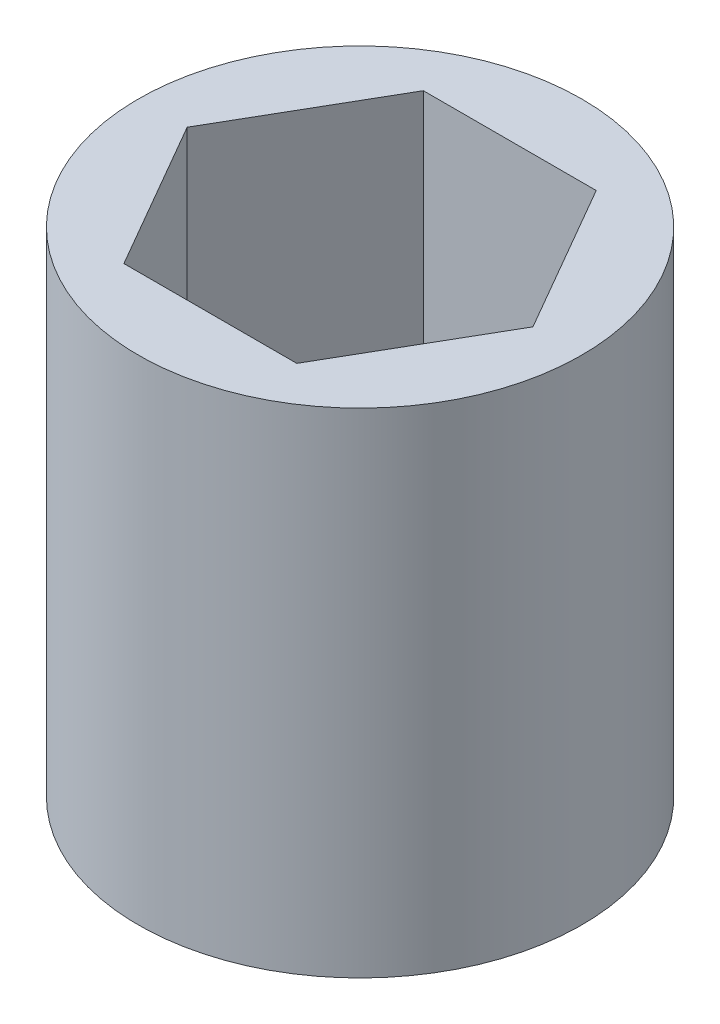
ISO-10303-21;
HEADER;
FILE_DESCRIPTION(('STEP AP214'),'2;1');
FILE_NAME('part.step','',(''),(''),'','','');
FILE_SCHEMA(('AUTOMOTIVE_DESIGN { 1 0 10303 214 1 1 1 1 }'));
ENDSEC;
DATA;
#1=APPLICATION_CONTEXT('core data for automotive mechanical design processes');
#2=APPLICATION_PROTOCOL_DEFINITION('international standard','automotive_design',2000,#1);
#3=PRODUCT_CONTEXT('',#1,'mechanical');
#4=PRODUCT('Part','Part','',(#3));
#5=PRODUCT_RELATED_PRODUCT_CATEGORY('part','',(#4));
#6=PRODUCT_DEFINITION_FORMATION('','',#4);
#7=PRODUCT_DEFINITION_CONTEXT('part definition',#1,'design');
#8=PRODUCT_DEFINITION('design','',#6,#7);
#9=PRODUCT_DEFINITION_SHAPE('','',#8);
#10=(LENGTH_UNIT() NAMED_UNIT(*) SI_UNIT(.MILLI.,.METRE.));
#11=(NAMED_UNIT(*) PLANE_ANGLE_UNIT() SI_UNIT($,.RADIAN.));
#12=(NAMED_UNIT(*) SI_UNIT($,.STERADIAN.) SOLID_ANGLE_UNIT());
#13=UNCERTAINTY_MEASURE_WITH_UNIT(LENGTH_MEASURE(1.E-05),#10,'distance_accuracy_value','');
#14=(GEOMETRIC_REPRESENTATION_CONTEXT(3) GLOBAL_UNCERTAINTY_ASSIGNED_CONTEXT((#13)) GLOBAL_UNIT_ASSIGNED_CONTEXT((#10,
#11,#12)) REPRESENTATION_CONTEXT('',''));
#15=CARTESIAN_POINT('',(0.,0.,0.));
#16=DIRECTION('',(0.,0.,1.));
#17=DIRECTION('',(1.,0.,0.));
#18=AXIS2_PLACEMENT_3D('',#15,#16,#17);
#19=CARTESIAN_POINT('',(0.,22.606,0.));
#20=DIRECTION('',(0.,1.,0.));
#21=DIRECTION('',(0.,0.,1.));
#22=AXIS2_PLACEMENT_3D('',#19,#20,#21);
#23=PLANE('',#22);
#24=CARTESIAN_POINT('',(0.,22.606,0.));
#25=DIRECTION('',(0.,1.,0.));
#26=DIRECTION('',(0.,0.,1.));
#27=AXIS2_PLACEMENT_3D('',#24,#25,#26);
#28=CIRCLE('',#27,10.16);
#29=CARTESIAN_POINT('',(0.,22.606,-10.16));
#30=VERTEX_POINT('',#29);
#31=EDGE_CURVE('E11',#30,#30,#28,.T.);
#32=ORIENTED_EDGE('',*,*,#31,.T.);
#33=EDGE_LOOP('',(#32));
#34=FACE_BOUND('',#33,.T.);
#35=DIRECTION('',(-0.5,0.,-0.866025403784438));
#36=VECTOR('',#35,1.);
#37=CARTESIAN_POINT('',(7.9189362922049,22.606,0.));
#38=LINE('',#37,#36);
#39=CARTESIAN_POINT('',(7.9189362922049,22.606,0.));
#40=VERTEX_POINT('',#39);
#41=CARTESIAN_POINT('',(3.95946814610245,22.606,-6.858));
#42=VERTEX_POINT('',#41);
#43=EDGE_CURVE('E103',#40,#42,#38,.T.);
#44=ORIENTED_EDGE('',*,*,#43,.F.);
#45=DIRECTION('',(0.5,0.,-0.866025403784439));
#46=VECTOR('',#45,1.);
#47=CARTESIAN_POINT('',(3.95946814610245,22.606,6.858));
#48=LINE('',#47,#46);
#49=CARTESIAN_POINT('',(3.95946814610245,22.606,6.858));
#50=VERTEX_POINT('',#49);
#51=EDGE_CURVE('E95',#50,#40,#48,.T.);
#52=ORIENTED_EDGE('',*,*,#51,.F.);
#53=DIRECTION('',(1.,0.,0.));
#54=VECTOR('',#53,1.);
#55=CARTESIAN_POINT('',(-3.95946814610245,22.606,6.858));
#56=LINE('',#55,#54);
#57=CARTESIAN_POINT('',(-3.95946814610245,22.606,6.858));
#58=VERTEX_POINT('',#57);
#59=EDGE_CURVE('E125',#58,#50,#56,.T.);
#60=ORIENTED_EDGE('',*,*,#59,.F.);
#61=DIRECTION('',(0.5,0.,0.866025403784439));
#62=VECTOR('',#61,1.);
#63=CARTESIAN_POINT('',(-7.91893629220491,22.606,0.));
#64=LINE('',#63,#62);
#65=CARTESIAN_POINT('',(-7.91893629220491,22.606,0.));
#66=VERTEX_POINT('',#65);
#67=EDGE_CURVE('E123',#66,#58,#64,.T.);
#68=ORIENTED_EDGE('',*,*,#67,.F.);
#69=DIRECTION('',(-0.5,0.,0.866025403784439));
#70=VECTOR('',#69,1.);
#71=CARTESIAN_POINT('',(-3.95946814610245,22.606,-6.858));
#72=LINE('',#71,#70);
#73=CARTESIAN_POINT('',(-3.95946814610245,22.606,-6.858));
#74=VERTEX_POINT('',#73);
#75=EDGE_CURVE('E118',#74,#66,#72,.T.);
#76=ORIENTED_EDGE('',*,*,#75,.F.);
#77=DIRECTION('',(-1.,0.,0.));
#78=VECTOR('',#77,1.);
#79=CARTESIAN_POINT('',(3.95946814610245,22.606,-6.858));
#80=LINE('',#79,#78);
#81=EDGE_CURVE('E115',#42,#74,#80,.T.);
#82=ORIENTED_EDGE('',*,*,#81,.F.);
#83=EDGE_LOOP('',(#44,#52,#60,#68,#76,#82));
#84=FACE_BOUND('',#83,.T.);
#85=ADVANCED_FACE('F38',(#34,#84),#23,.T.);
#86=CARTESIAN_POINT('',(0.,0.,0.));
#87=DIRECTION('',(0.,1.,0.));
#88=DIRECTION('',(0.,0.,1.));
#89=AXIS2_PLACEMENT_3D('',#86,#87,#88);
#90=PLANE('',#89);
#91=CARTESIAN_POINT('',(0.,0.,0.));
#92=DIRECTION('',(0.,1.,0.));
#93=DIRECTION('',(0.,0.,1.));
#94=AXIS2_PLACEMENT_3D('',#91,#92,#93);
#95=CIRCLE('',#94,10.16);
#96=CARTESIAN_POINT('',(0.,0.,-10.16));
#97=VERTEX_POINT('',#96);
#98=EDGE_CURVE('E42',#97,#97,#95,.T.);
#99=ORIENTED_EDGE('',*,*,#98,.F.);
#100=EDGE_LOOP('',(#99));
#101=FACE_BOUND('',#100,.T.);
#102=DIRECTION('',(0.5,0.,-0.866025403784439));
#103=VECTOR('',#102,1.);
#104=CARTESIAN_POINT('',(3.95946814610245,0.,6.858));
#105=LINE('',#104,#103);
#106=CARTESIAN_POINT('',(3.95946814610245,0.,6.858));
#107=VERTEX_POINT('',#106);
#108=CARTESIAN_POINT('',(7.9189362922049,0.,0.));
#109=VERTEX_POINT('',#108);
#110=EDGE_CURVE('E62',#107,#109,#105,.T.);
#111=ORIENTED_EDGE('',*,*,#110,.T.);
#112=DIRECTION('',(-0.5,0.,-0.866025403784438));
#113=VECTOR('',#112,1.);
#114=CARTESIAN_POINT('',(7.9189362922049,0.,0.));
#115=LINE('',#114,#113);
#116=CARTESIAN_POINT('',(3.95946814610245,0.,-6.858));
#117=VERTEX_POINT('',#116);
#118=EDGE_CURVE('E110',#109,#117,#115,.T.);
#119=ORIENTED_EDGE('',*,*,#118,.T.);
#120=DIRECTION('',(-1.,0.,0.));
#121=VECTOR('',#120,1.);
#122=CARTESIAN_POINT('',(3.95946814610245,0.,-6.858));
#123=LINE('',#122,#121);
#124=CARTESIAN_POINT('',(-3.95946814610245,0.,-6.858));
#125=VERTEX_POINT('',#124);
#126=EDGE_CURVE('E129',#117,#125,#123,.T.);
#127=ORIENTED_EDGE('',*,*,#126,.T.);
#128=DIRECTION('',(-0.5,0.,0.866025403784439));
#129=VECTOR('',#128,1.);
#130=CARTESIAN_POINT('',(-3.95946814610245,0.,-6.858));
#131=LINE('',#130,#129);
#132=CARTESIAN_POINT('',(-7.91893629220491,0.,0.));
#133=VERTEX_POINT('',#132);
#134=EDGE_CURVE('E133',#125,#133,#131,.T.);
#135=ORIENTED_EDGE('',*,*,#134,.T.);
#136=DIRECTION('',(0.5,0.,0.866025403784439));
#137=VECTOR('',#136,1.);
#138=CARTESIAN_POINT('',(-7.91893629220491,0.,0.));
#139=LINE('',#138,#137);
#140=CARTESIAN_POINT('',(-3.95946814610245,0.,6.858));
#141=VERTEX_POINT('',#140);
#142=EDGE_CURVE('E137',#133,#141,#139,.T.);
#143=ORIENTED_EDGE('',*,*,#142,.T.);
#144=DIRECTION('',(1.,0.,0.));
#145=VECTOR('',#144,1.);
#146=CARTESIAN_POINT('',(-3.95946814610245,0.,6.858));
#147=LINE('',#146,#145);
#148=EDGE_CURVE('E104',#141,#107,#147,.T.);
#149=ORIENTED_EDGE('',*,*,#148,.T.);
#150=EDGE_LOOP('',(#111,#119,#127,#135,#143,#149));
#151=FACE_BOUND('',#150,.T.);
#152=ADVANCED_FACE('F157',(#101,#151),#90,.F.);
#153=CARTESIAN_POINT('',(0.,22.606,0.));
#154=DIRECTION('',(0.,-1.,0.));
#155=DIRECTION('',(0.,0.,-1.));
#156=AXIS2_PLACEMENT_3D('',#153,#154,#155);
#157=CYLINDRICAL_SURFACE('',#156,10.16);
#158=CARTESIAN_POINT('',(0.,22.606,-10.16));
#159=CARTESIAN_POINT('',(0.,22.3705208333333,-10.16));
#160=CARTESIAN_POINT('',(0.,22.1350416666667,-10.16));
#161=CARTESIAN_POINT('',(0.,21.6640833333333,-10.16));
#162=CARTESIAN_POINT('',(0.,21.4286041666667,-10.16));
#163=CARTESIAN_POINT('',(0.,20.9576458333333,-10.16));
#164=CARTESIAN_POINT('',(0.,20.7221666666667,-10.16));
#165=CARTESIAN_POINT('',(0.,20.2512083333333,-10.16));
#166=CARTESIAN_POINT('',(0.,20.0157291666667,-10.16));
#167=CARTESIAN_POINT('',(0.,19.5447708333333,-10.16));
#168=CARTESIAN_POINT('',(0.,19.3092916666667,-10.16));
#169=CARTESIAN_POINT('',(0.,18.8383333333333,-10.16));
#170=CARTESIAN_POINT('',(0.,18.6028541666667,-10.16));
#171=CARTESIAN_POINT('',(0.,18.1318958333333,-10.16));
#172=CARTESIAN_POINT('',(0.,17.8964166666667,-10.16));
#173=CARTESIAN_POINT('',(0.,17.4254583333333,-10.16));
#174=CARTESIAN_POINT('',(0.,17.1899791666667,-10.16));
#175=CARTESIAN_POINT('',(0.,16.7190208333333,-10.16));
#176=CARTESIAN_POINT('',(0.,16.4835416666667,-10.16));
#177=CARTESIAN_POINT('',(0.,16.0125833333333,-10.16));
#178=CARTESIAN_POINT('',(0.,15.7771041666667,-10.16));
#179=CARTESIAN_POINT('',(0.,15.3061458333333,-10.16));
#180=CARTESIAN_POINT('',(0.,15.0706666666667,-10.16));
#181=CARTESIAN_POINT('',(0.,14.5997083333333,-10.16));
#182=CARTESIAN_POINT('',(0.,14.3642291666667,-10.16));
#183=CARTESIAN_POINT('',(0.,13.8932708333333,-10.16));
#184=CARTESIAN_POINT('',(0.,13.6577916666667,-10.16));
#185=CARTESIAN_POINT('',(0.,13.1868333333333,-10.16));
#186=CARTESIAN_POINT('',(0.,12.9513541666667,-10.16));
#187=CARTESIAN_POINT('',(0.,12.4803958333333,-10.16));
#188=CARTESIAN_POINT('',(0.,12.2449166666667,-10.16));
#189=CARTESIAN_POINT('',(0.,11.7739583333333,-10.16));
#190=CARTESIAN_POINT('',(0.,11.5384791666667,-10.16));
#191=CARTESIAN_POINT('',(0.,11.0675208333333,-10.16));
#192=CARTESIAN_POINT('',(0.,10.8320416666667,-10.16));
#193=CARTESIAN_POINT('',(0.,10.3610833333333,-10.16));
#194=CARTESIAN_POINT('',(0.,10.1256041666667,-10.16));
#195=CARTESIAN_POINT('',(0.,9.65464583333333,-10.16));
#196=CARTESIAN_POINT('',(0.,9.41916666666666,-10.16));
#197=CARTESIAN_POINT('',(0.,8.94820833333333,-10.16));
#198=CARTESIAN_POINT('',(0.,8.71272916666666,-10.16));
#199=CARTESIAN_POINT('',(0.,8.24177083333333,-10.16));
#200=CARTESIAN_POINT('',(0.,8.00629166666666,-10.16));
#201=CARTESIAN_POINT('',(0.,7.53533333333333,-10.16));
#202=CARTESIAN_POINT('',(0.,7.29985416666666,-10.16));
#203=CARTESIAN_POINT('',(0.,6.82889583333333,-10.16));
#204=CARTESIAN_POINT('',(0.,6.59341666666666,-10.16));
#205=CARTESIAN_POINT('',(0.,6.12245833333333,-10.16));
#206=CARTESIAN_POINT('',(0.,5.88697916666667,-10.16));
#207=CARTESIAN_POINT('',(0.,5.41602083333333,-10.16));
#208=CARTESIAN_POINT('',(0.,5.18054166666667,-10.16));
#209=CARTESIAN_POINT('',(0.,4.70958333333333,-10.16));
#210=CARTESIAN_POINT('',(0.,4.47410416666667,-10.16));
#211=CARTESIAN_POINT('',(0.,4.00314583333333,-10.16));
#212=CARTESIAN_POINT('',(0.,3.76766666666667,-10.16));
#213=CARTESIAN_POINT('',(0.,3.29670833333333,-10.16));
#214=CARTESIAN_POINT('',(0.,3.06122916666667,-10.16));
#215=CARTESIAN_POINT('',(0.,2.59027083333333,-10.16));
#216=CARTESIAN_POINT('',(0.,2.35479166666666,-10.16));
#217=CARTESIAN_POINT('',(0.,1.88383333333333,-10.16));
#218=CARTESIAN_POINT('',(0.,1.64835416666666,-10.16));
#219=CARTESIAN_POINT('',(0.,1.17739583333333,-10.16));
#220=CARTESIAN_POINT('',(0.,0.941916666666664,-10.16));
#221=CARTESIAN_POINT('',(0.,0.47095833333333,-10.16));
#222=CARTESIAN_POINT('',(0.,0.235479166666663,-10.16));
#223=CARTESIAN_POINT('',(0.,0.,-10.16));
#224=B_SPLINE_CURVE_WITH_KNOTS('',3,(#158,#159,#160,#161,#162,#163,#164,#165,#166,#167,#168,
#169,#170,#171,#172,#173,#174,#175,#176,#177,#178,#179,#180,#181,#182,#183,#184,#185,#186,#187,
#188,#189,#190,#191,#192,#193,#194,#195,#196,#197,#198,#199,#200,#201,#202,#203,#204,#205,#206,
#207,#208,#209,#210,#211,#212,#213,#214,#215,#216,#217,#218,#219,#220,#221,#222,#223),
.UNSPECIFIED.,.F.,.F.,(4,2,2,2,2,2,2,2,2,2,2,2,2,2,2,2,2,2,2,2,2,2,2,2,2,2,2,2,2,2,2,2,4),(0.,
0.7064375,1.412875,2.1193125,2.82575,3.5321875,4.238625,4.9450625,5.6515,6.3579375,7.064375,
7.7708125,8.47725,9.1836875,9.890125,10.5965625,11.303,12.0094375,12.715875,13.4223125,14.12875,
14.8351875,15.541625,16.2480625,16.9545,17.6609375,18.367375,19.0738125,19.78025,20.4866875,
21.193125,21.8995625,22.606),.UNSPECIFIED.);
#225=EDGE_CURVE('BSEAM40',#30,#97,#224,.T.);
#226=ORIENTED_EDGE('',*,*,#31,.F.);
#227=ORIENTED_EDGE('',*,*,#98,.T.);
#228=ORIENTED_EDGE('',*,*,#225,.T.);
#229=ORIENTED_EDGE('',*,*,#225,.F.);
#230=EDGE_LOOP('',(#226,#228,#227,#229));
#231=FACE_BOUND('',#230,.T.);
#232=ADVANCED_FACE('F40',(#231),#157,.T.);
#233=CARTESIAN_POINT('',(3.95946814610245,22.606,6.858));
#234=DIRECTION('',(-0.866025403784439,0.,-0.5));
#235=DIRECTION('',(-0.5,0.,0.866025403784439));
#236=AXIS2_PLACEMENT_3D('',#233,#234,#235);
#237=PLANE('',#236);
#238=ORIENTED_EDGE('',*,*,#110,.F.);
#239=DIRECTION('',(0.,-1.,0.));
#240=VECTOR('',#239,1.);
#241=CARTESIAN_POINT('',(3.95946814610245,22.606,6.858));
#242=LINE('',#241,#240);
#243=EDGE_CURVE('E99',#50,#107,#242,.T.);
#244=ORIENTED_EDGE('',*,*,#243,.F.);
#245=ORIENTED_EDGE('',*,*,#51,.T.);
#246=DIRECTION('',(0.,-1.,0.));
#247=VECTOR('',#246,1.);
#248=CARTESIAN_POINT('',(7.9189362922049,22.606,0.));
#249=LINE('',#248,#247);
#250=EDGE_CURVE('E98',#40,#109,#249,.T.);
#251=ORIENTED_EDGE('',*,*,#250,.T.);
#252=EDGE_LOOP('',(#238,#244,#245,#251));
#253=FACE_BOUND('',#252,.T.);
#254=ADVANCED_FACE('F97',(#253),#237,.T.);
#255=CARTESIAN_POINT('',(7.9189362922049,22.606,0.));
#256=DIRECTION('',(-0.866025403784438,0.,0.5));
#257=DIRECTION('',(0.5,0.,0.866025403784439));
#258=AXIS2_PLACEMENT_3D('',#255,#256,#257);
#259=PLANE('',#258);
#260=ORIENTED_EDGE('',*,*,#118,.F.);
#261=ORIENTED_EDGE('',*,*,#250,.F.);
#262=ORIENTED_EDGE('',*,*,#43,.T.);
#263=DIRECTION('',(0.,-1.,0.));
#264=VECTOR('',#263,1.);
#265=CARTESIAN_POINT('',(3.95946814610245,22.606,-6.858));
#266=LINE('',#265,#264);
#267=EDGE_CURVE('E111',#42,#117,#266,.T.);
#268=ORIENTED_EDGE('',*,*,#267,.T.);
#269=EDGE_LOOP('',(#260,#261,#262,#268));
#270=FACE_BOUND('',#269,.T.);
#271=ADVANCED_FACE('F107',(#270),#259,.T.);
#272=CARTESIAN_POINT('',(3.95946814610245,22.606,-6.858));
#273=DIRECTION('',(0.,0.,1.));
#274=DIRECTION('',(1.,0.,0.));
#275=AXIS2_PLACEMENT_3D('',#272,#273,#274);
#276=PLANE('',#275);
#277=ORIENTED_EDGE('',*,*,#126,.F.);
#278=ORIENTED_EDGE('',*,*,#267,.F.);
#279=ORIENTED_EDGE('',*,*,#81,.T.);
#280=DIRECTION('',(0.,-1.,0.));
#281=VECTOR('',#280,1.);
#282=CARTESIAN_POINT('',(-3.95946814610245,22.606,-6.858));
#283=LINE('',#282,#281);
#284=EDGE_CURVE('E148',#74,#125,#283,.T.);
#285=ORIENTED_EDGE('',*,*,#284,.T.);
#286=EDGE_LOOP('',(#277,#278,#279,#285));
#287=FACE_BOUND('',#286,.T.);
#288=ADVANCED_FACE('F153',(#287),#276,.T.);
#289=CARTESIAN_POINT('',(-3.95946814610245,22.606,-6.858));
#290=DIRECTION('',(0.866025403784439,0.,0.5));
#291=DIRECTION('',(0.5,0.,-0.866025403784439));
#292=AXIS2_PLACEMENT_3D('',#289,#290,#291);
#293=PLANE('',#292);
#294=ORIENTED_EDGE('',*,*,#134,.F.);
#295=ORIENTED_EDGE('',*,*,#284,.F.);
#296=ORIENTED_EDGE('',*,*,#75,.T.);
#297=DIRECTION('',(0.,-1.,0.));
#298=VECTOR('',#297,1.);
#299=CARTESIAN_POINT('',(-7.91893629220491,22.606,0.));
#300=LINE('',#299,#298);
#301=EDGE_CURVE('E145',#66,#133,#300,.T.);
#302=ORIENTED_EDGE('',*,*,#301,.T.);
#303=EDGE_LOOP('',(#294,#295,#296,#302));
#304=FACE_BOUND('',#303,.T.);
#305=ADVANCED_FACE('F165',(#304),#293,.T.);
#306=CARTESIAN_POINT('',(-7.91893629220491,22.606,0.));
#307=DIRECTION('',(0.866025403784438,0.,-0.5));
#308=DIRECTION('',(-0.5,0.,-0.866025403784439));
#309=AXIS2_PLACEMENT_3D('',#306,#307,#308);
#310=PLANE('',#309);
#311=ORIENTED_EDGE('',*,*,#142,.F.);
#312=ORIENTED_EDGE('',*,*,#301,.F.);
#313=ORIENTED_EDGE('',*,*,#67,.T.);
#314=DIRECTION('',(0.,-1.,0.));
#315=VECTOR('',#314,1.);
#316=CARTESIAN_POINT('',(-3.95946814610245,22.606,6.858));
#317=LINE('',#316,#315);
#318=EDGE_CURVE('E54',#58,#141,#317,.T.);
#319=ORIENTED_EDGE('',*,*,#318,.T.);
#320=EDGE_LOOP('',(#311,#312,#313,#319));
#321=FACE_BOUND('',#320,.T.);
#322=ADVANCED_FACE('F163',(#321),#310,.T.);
#323=CARTESIAN_POINT('',(-3.95946814610245,22.606,6.858));
#324=DIRECTION('',(0.,0.,-1.));
#325=DIRECTION('',(-1.,0.,0.));
#326=AXIS2_PLACEMENT_3D('',#323,#324,#325);
#327=PLANE('',#326);
#328=ORIENTED_EDGE('',*,*,#148,.F.);
#329=ORIENTED_EDGE('',*,*,#318,.F.);
#330=ORIENTED_EDGE('',*,*,#59,.T.);
#331=ORIENTED_EDGE('',*,*,#243,.T.);
#332=EDGE_LOOP('',(#328,#329,#330,#331));
#333=FACE_BOUND('',#332,.T.);
#334=ADVANCED_FACE('F159',(#333),#327,.T.);
#335=CLOSED_SHELL('',(#85,#152,#232,#254,#271,#288,#305,#322,#334));
#336=MANIFOLD_SOLID_BREP('B2',#335);
#337=ADVANCED_BREP_SHAPE_REPRESENTATION('',(#18,#336),#14);
#338=SHAPE_DEFINITION_REPRESENTATION(#9,#337);
ENDSEC;
END-ISO-10303-21;
